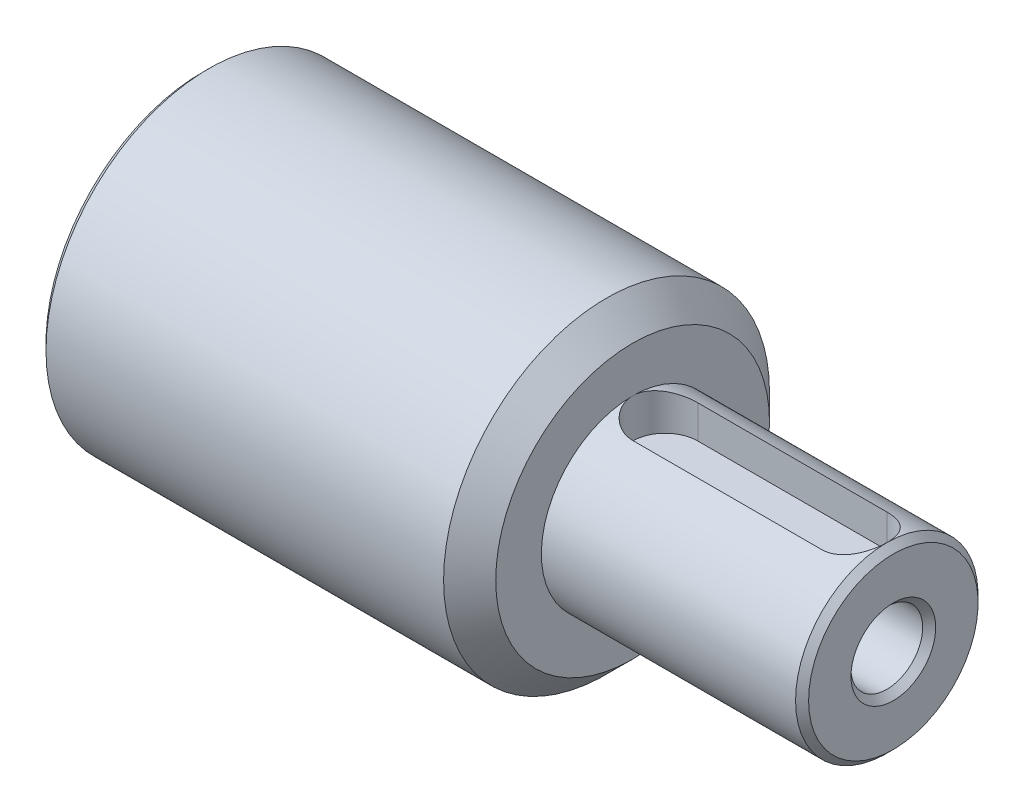
ISO-10303-21;
HEADER;
FILE_DESCRIPTION(('STEP AP214'),'2;1');
FILE_NAME('part.step','',(''),(''),'','','');
FILE_SCHEMA(('AUTOMOTIVE_DESIGN { 1 0 10303 214 1 1 1 1 }'));
ENDSEC;
DATA;
#1=APPLICATION_CONTEXT('core data for automotive mechanical design processes');
#2=APPLICATION_PROTOCOL_DEFINITION('international standard','automotive_design',2000,#1);
#3=PRODUCT_CONTEXT('',#1,'mechanical');
#4=PRODUCT('Part','Part','',(#3));
#5=PRODUCT_RELATED_PRODUCT_CATEGORY('part','',(#4));
#6=PRODUCT_DEFINITION_FORMATION('','',#4);
#7=PRODUCT_DEFINITION_CONTEXT('part definition',#1,'design');
#8=PRODUCT_DEFINITION('design','',#6,#7);
#9=PRODUCT_DEFINITION_SHAPE('','',#8);
#10=(LENGTH_UNIT() NAMED_UNIT(*) SI_UNIT(.MILLI.,.METRE.));
#11=(NAMED_UNIT(*) PLANE_ANGLE_UNIT() SI_UNIT($,.RADIAN.));
#12=(NAMED_UNIT(*) SI_UNIT($,.STERADIAN.) SOLID_ANGLE_UNIT());
#13=UNCERTAINTY_MEASURE_WITH_UNIT(LENGTH_MEASURE(1.E-05),#10,'distance_accuracy_value','');
#14=(GEOMETRIC_REPRESENTATION_CONTEXT(3) GLOBAL_UNCERTAINTY_ASSIGNED_CONTEXT((#13)) GLOBAL_UNIT_ASSIGNED_CONTEXT((#10,
#11,#12)) REPRESENTATION_CONTEXT('',''));
#15=CARTESIAN_POINT('',(0.,0.,0.));
#16=DIRECTION('',(0.,0.,1.));
#17=DIRECTION('',(1.,0.,0.));
#18=AXIS2_PLACEMENT_3D('',#15,#16,#17);
#19=CARTESIAN_POINT('',(0.,0.,0.));
#20=DIRECTION('',(-1.,0.,0.));
#21=DIRECTION('',(0.,0.,1.));
#22=AXIS2_PLACEMENT_3D('',#19,#20,#21);
#23=CYLINDRICAL_SURFACE('',#22,7.);
#24=CARTESIAN_POINT('',(27.,0.,0.));
#25=DIRECTION('',(1.,0.,0.));
#26=DIRECTION('',(0.,0.,-1.));
#27=AXIS2_PLACEMENT_3D('',#24,#25,#26);
#28=CIRCLE('',#27,7.);
#29=CARTESIAN_POINT('',(27.,0.,-7.));
#30=VERTEX_POINT('',#29);
#31=EDGE_CURVE('E186',#30,#30,#28,.T.);
#32=ORIENTED_EDGE('',*,*,#31,.T.);
#33=EDGE_LOOP('',(#32));
#34=FACE_BOUND('',#33,.T.);
#35=DIRECTION('',(-1.,0.,0.));
#36=VECTOR('',#35,1.);
#37=CARTESIAN_POINT('',(0.,6.53834841531101,-2.5));
#38=LINE('',#37,#36);
#39=CARTESIAN_POINT('',(26.,6.53834841531101,-2.5));
#40=VERTEX_POINT('',#39);
#41=CARTESIAN_POINT('',(0.499999999999983,6.53834841531101,-2.5));
#42=VERTEX_POINT('',#41);
#43=EDGE_CURVE('E486',#40,#42,#38,.T.);
#44=ORIENTED_EDGE('',*,*,#43,.T.);
#45=CARTESIAN_POINT('',(0.499999999999983,0.,0.));
#46=DIRECTION('',(1.,0.,0.));
#47=DIRECTION('',(0.,0.,-1.));
#48=AXIS2_PLACEMENT_3D('',#45,#46,#47);
#49=CIRCLE('',#48,7.);
#50=CARTESIAN_POINT('',(0.499999999999983,6.53834841531101,2.5));
#51=VERTEX_POINT('',#50);
#52=EDGE_CURVE('E234',#42,#51,#49,.F.);
#53=ORIENTED_EDGE('',*,*,#52,.T.);
#54=DIRECTION('',(-1.,0.,0.));
#55=VECTOR('',#54,1.);
#56=CARTESIAN_POINT('',(0.,6.53834841531101,2.5));
#57=LINE('',#56,#55);
#58=CARTESIAN_POINT('',(26.,6.53834841531101,2.5));
#59=VERTEX_POINT('',#58);
#60=EDGE_CURVE('E205',#51,#59,#57,.F.);
#61=ORIENTED_EDGE('',*,*,#60,.T.);
#62=CARTESIAN_POINT('',(26.,0.,0.));
#63=DIRECTION('',(-1.,0.,0.));
#64=DIRECTION('',(0.,0.,1.));
#65=AXIS2_PLACEMENT_3D('',#62,#63,#64);
#66=CIRCLE('',#65,7.);
#67=EDGE_CURVE('E202',#40,#59,#66,.F.);
#68=ORIENTED_EDGE('',*,*,#67,.F.);
#69=EDGE_LOOP('',(#44,#53,#61,#68));
#70=FACE_BOUND('',#69,.T.);
#71=ADVANCED_FACE('F39',(#34,#70),#23,.F.);
#72=CARTESIAN_POINT('',(0.,7.,0.));
#73=DIRECTION('',(1.,0.,0.));
#74=DIRECTION('',(0.,0.,-1.));
#75=AXIS2_PLACEMENT_3D('',#72,#73,#74);
#76=PLANE('',#75);
#77=CARTESIAN_POINT('',(0.,0.,0.));
#78=DIRECTION('',(1.,0.,0.));
#79=DIRECTION('',(0.,0.,-1.));
#80=AXIS2_PLACEMENT_3D('',#77,#78,#79);
#81=CIRCLE('',#80,12.);
#82=CARTESIAN_POINT('',(0.,0.,-12.));
#83=VERTEX_POINT('',#82);
#84=EDGE_CURVE('E219',#83,#83,#81,.F.);
#85=ORIENTED_EDGE('',*,*,#84,.T.);
#86=EDGE_LOOP('',(#85));
#87=FACE_BOUND('',#86,.T.);
#88=DIRECTION('',(0.,-1.,0.));
#89=VECTOR('',#88,1.);
#90=CARTESIAN_POINT('',(0.,7.,2.5));
#91=LINE('',#90,#89);
#92=CARTESIAN_POINT('',(0.,9.,2.5));
#93=VERTEX_POINT('',#92);
#94=CARTESIAN_POINT('',(0.,7.07106781186546,2.5));
#95=VERTEX_POINT('',#94);
#96=EDGE_CURVE('E198',#93,#95,#91,.T.);
#97=ORIENTED_EDGE('',*,*,#96,.T.);
#98=CARTESIAN_POINT('',(0.,0.,0.));
#99=DIRECTION('',(1.,0.,0.));
#100=DIRECTION('',(0.,0.,-1.));
#101=AXIS2_PLACEMENT_3D('',#98,#99,#100);
#102=CIRCLE('',#101,7.49999999999999);
#103=CARTESIAN_POINT('',(0.,7.07106781186546,-2.5));
#104=VERTEX_POINT('',#103);
#105=EDGE_CURVE('E217',#95,#104,#102,.T.);
#106=ORIENTED_EDGE('',*,*,#105,.T.);
#107=DIRECTION('',(0.,-1.,0.));
#108=VECTOR('',#107,1.);
#109=CARTESIAN_POINT('',(0.,9.,-2.5));
#110=LINE('',#109,#108);
#111=CARTESIAN_POINT('',(0.,9.,-2.5));
#112=VERTEX_POINT('',#111);
#113=EDGE_CURVE('E495',#112,#104,#110,.T.);
#114=ORIENTED_EDGE('',*,*,#113,.F.);
#115=DIRECTION('',(0.,0.,-1.));
#116=VECTOR('',#115,1.);
#117=CARTESIAN_POINT('',(0.,9.,-2.5));
#118=LINE('',#117,#116);
#119=EDGE_CURVE('E479',#93,#112,#118,.T.);
#120=ORIENTED_EDGE('',*,*,#119,.F.);
#121=EDGE_LOOP('',(#97,#106,#114,#120));
#122=FACE_BOUND('',#121,.T.);
#123=ADVANCED_FACE('F277',(#87,#122),#76,.F.);
#124=CARTESIAN_POINT('',(0.,0.,0.));
#125=DIRECTION('',(-1.,0.,0.));
#126=DIRECTION('',(0.,0.,1.));
#127=AXIS2_PLACEMENT_3D('',#124,#125,#126);
#128=CYLINDRICAL_SURFACE('',#127,12.5);
#129=CARTESIAN_POINT('',(0.499999999999978,0.,0.));
#130=DIRECTION('',(1.,0.,0.));
#131=DIRECTION('',(0.,0.,-1.));
#132=AXIS2_PLACEMENT_3D('',#129,#130,#131);
#133=CIRCLE('',#132,12.5);
#134=CARTESIAN_POINT('',(0.499999999999978,0.,-12.5));
#135=VERTEX_POINT('',#134);
#136=EDGE_CURVE('E222',#135,#135,#133,.T.);
#137=ORIENTED_EDGE('',*,*,#136,.T.);
#138=EDGE_LOOP('',(#137));
#139=FACE_BOUND('',#138,.T.);
#140=CARTESIAN_POINT('',(31.,0.,0.));
#141=DIRECTION('',(-1.,0.,0.));
#142=DIRECTION('',(0.,0.,1.));
#143=AXIS2_PLACEMENT_3D('',#140,#141,#142);
#144=CIRCLE('',#143,12.5);
#145=CARTESIAN_POINT('',(31.,0.,12.5));
#146=VERTEX_POINT('',#145);
#147=EDGE_CURVE('E211',#146,#146,#144,.T.);
#148=ORIENTED_EDGE('',*,*,#147,.T.);
#149=EDGE_LOOP('',(#148));
#150=FACE_BOUND('',#149,.T.);
#151=ADVANCED_FACE('F283',(#139,#150),#128,.T.);
#152=CARTESIAN_POINT('',(33.,12.5,0.));
#153=DIRECTION('',(-1.,0.,0.));
#154=DIRECTION('',(0.,0.,1.));
#155=AXIS2_PLACEMENT_3D('',#152,#153,#154);
#156=PLANE('',#155);
#157=CARTESIAN_POINT('',(33.,0.,0.));
#158=DIRECTION('',(-1.,0.,0.));
#159=DIRECTION('',(0.,0.,1.));
#160=AXIS2_PLACEMENT_3D('',#157,#158,#159);
#161=CIRCLE('',#160,10.5);
#162=CARTESIAN_POINT('',(33.,0.,10.5));
#163=VERTEX_POINT('',#162);
#164=EDGE_CURVE('E214',#163,#163,#161,.F.);
#165=ORIENTED_EDGE('',*,*,#164,.T.);
#166=EDGE_LOOP('',(#165));
#167=FACE_BOUND('',#166,.T.);
#168=CARTESIAN_POINT('',(33.,0.,0.));
#169=DIRECTION('',(-1.,0.,0.));
#170=DIRECTION('',(0.,0.,1.));
#171=AXIS2_PLACEMENT_3D('',#168,#169,#170);
#172=CIRCLE('',#171,7.);
#173=CARTESIAN_POINT('',(33.,7.,0.));
#174=VERTEX_POINT('',#173);
#175=EDGE_CURVE('E195',#174,#174,#172,.T.);
#176=ORIENTED_EDGE('',*,*,#175,.T.);
#177=EDGE_LOOP('',(#176));
#178=FACE_BOUND('',#177,.T.);
#179=ADVANCED_FACE('F197',(#167,#178),#156,.F.);
#180=CARTESIAN_POINT('',(0.,0.,0.));
#181=DIRECTION('',(-1.,0.,0.));
#182=DIRECTION('',(0.,0.,1.));
#183=AXIS2_PLACEMENT_3D('',#180,#181,#182);
#184=CYLINDRICAL_SURFACE('',#183,7.);
#185=DIRECTION('',(-1.,0.,0.));
#186=VECTOR('',#185,1.);
#187=CARTESIAN_POINT('',(0.,6.53834841531101,-2.5));
#188=LINE('',#187,#186);
#189=CARTESIAN_POINT('',(35.5,6.53834841531101,-2.5));
#190=VERTEX_POINT('',#189);
#191=CARTESIAN_POINT('',(50.,6.53834841531101,-2.5));
#192=VERTEX_POINT('',#191);
#193=EDGE_CURVE('E43',#190,#192,#188,.F.);
#194=ORIENTED_EDGE('',*,*,#193,.T.);
#195=CARTESIAN_POINT('',(50.,6.53834841531101,-2.5));
#196=CARTESIAN_POINT('',(50.0678892457289,6.53833653785133,-2.50000932220903));
#197=CARTESIAN_POINT('',(50.1357719326391,6.53940549922738,-2.49723485076693));
#198=CARTESIAN_POINT('',(50.2710039106114,6.54361657478134,-2.48619102118159));
#199=CARTESIAN_POINT('',(50.3383533586061,6.54675805418063,-2.47792334551208));
#200=CARTESIAN_POINT('',(50.4718214146028,6.55501217637942,-2.45600175285899));
#201=CARTESIAN_POINT('',(50.5379433363398,6.56011831705676,-2.44236559963954));
#202=CARTESIAN_POINT('',(50.6687018351085,6.57213177854175,-2.40985115466648));
#203=CARTESIAN_POINT('',(50.7333383463124,6.57903917900746,-2.39097263107435));
#204=CARTESIAN_POINT('',(50.9242643664775,6.6021493436571,-2.32673964179204));
#205=CARTESIAN_POINT('',(51.0477904521356,6.62075475340845,-2.27375112606986));
#206=CARTESIAN_POINT('',(51.284230333128,6.6622539736071,-2.14910757865425));
#207=CARTESIAN_POINT('',(51.3971363167355,6.68515090424876,-2.07743895048849));
#208=CARTESIAN_POINT('',(51.6142152133527,6.73379913792224,-1.91402571101969));
#209=CARTESIAN_POINT('',(51.7178464751959,6.75962864041371,-1.82158337146743));
#210=CARTESIAN_POINT('',(51.9085087047164,6.81057592323031,-1.6207338877633));
#211=CARTESIAN_POINT('',(51.9955365792434,6.83569357019868,-1.51232377552673));
#212=CARTESIAN_POINT('',(52.153089855455,6.88331133279046,-1.27853915335934));
#213=CARTESIAN_POINT('',(52.2230315218605,6.90570835223797,-1.15274833789185));
#214=CARTESIAN_POINT('',(52.3405366467974,6.94442357672633,-0.890250825476634));
#215=CARTESIAN_POINT('',(52.388107779046,6.96074386585465,-0.753547890540325));
#216=CARTESIAN_POINT('',(52.4576406021824,6.9849105051071,-0.478829979256173));
#217=CARTESIAN_POINT('',(52.4805391304711,6.99306594352515,-0.341079835227465));
#218=CARTESIAN_POINT('',(52.5030684027776,7.00108798053822,-0.0634643052969029));
#219=CARTESIAN_POINT('',(52.5027055860347,7.00095687302702,0.0764004845074485));
#220=CARTESIAN_POINT('',(52.4792887262389,6.99262258049077,0.347593258486946));
#221=CARTESIAN_POINT('',(52.4572552058015,6.98478243583516,0.479022407078722));
#222=CARTESIAN_POINT('',(52.3928265758412,6.96237832507347,0.736175812143609));
#223=CARTESIAN_POINT('',(52.3504303156375,6.94781397899037,0.861899745780465));
#224=CARTESIAN_POINT('',(52.2459530884347,6.91316506890369,1.10616102429807));
#225=CARTESIAN_POINT('',(52.1836042850399,6.89300592164314,1.22457279066906));
#226=CARTESIAN_POINT('',(52.0412206647766,6.84923355616321,1.44953531305523));
#227=CARTESIAN_POINT('',(51.9611804762164,6.82561928959263,1.5560824517677));
#228=CARTESIAN_POINT('',(51.7806767363433,6.7759054780549,1.7603244525607));
#229=CARTESIAN_POINT('',(51.6793502768551,6.74974055843875,1.85724185700418));
#230=CARTESIAN_POINT('',(51.4616726358344,6.69890342468975,2.03299914621296));
#231=CARTESIAN_POINT('',(51.3453160948315,6.67423174765257,2.11183255456462));
#232=CARTESIAN_POINT('',(51.098057401478,6.62877803875405,2.25049860898458));
#233=CARTESIAN_POINT('',(50.9669210244946,6.60807875118994,2.30994207989625));
#234=CARTESIAN_POINT('',(50.6956351984178,6.57388213610267,2.40555439725849));
#235=CARTESIAN_POINT('',(50.555500858831,6.56037307165053,2.44176119399954));
#236=CARTESIAN_POINT('',(50.3449694557358,6.54708542245562,2.47705497148627));
#237=CARTESIAN_POINT('',(50.2762636982282,6.54382010967907,2.48565347586445));
#238=CARTESIAN_POINT('',(50.1383848358083,6.53944910829676,2.49712352174882));
#239=CARTESIAN_POINT('',(50.0692123328995,6.53834103140935,2.50000139665367));
#240=CARTESIAN_POINT('',(50.,6.53834841531101,2.5));
#241=B_SPLINE_CURVE_WITH_KNOTS('',3,(#195,#196,#197,#198,#199,#200,#201,#202,#203,#204,#205,
#206,#207,#208,#209,#210,#211,#212,#213,#214,#215,#216,#217,#218,#219,#220,#221,#222,#223,#224,
#225,#226,#227,#228,#229,#230,#231,#232,#233,#234,#235,#236,#237,#238,#239,#240),.UNSPECIFIED.,
.F.,.F.,(4,2,2,2,2,2,2,2,2,2,2,2,2,2,2,2,2,2,2,2,2,2,4),(0.,0.203591628551592,0.407120929225535,
0.609982356545741,0.812852756635989,1.21793118555512,1.6233052814847,2.0451597231193,
2.4670926781184,2.9018839896556,3.33652604665237,3.75400993940861,4.17137826416922,
4.56998920861347,4.96862268086887,5.37284909448639,5.77719841367921,6.20315837945088,
6.6292706567472,7.06347329058504,7.49696496492443,7.70468580162772,7.91217653896403),.UNSPECIFIED.);
#242=CARTESIAN_POINT('',(52.5,7.,0.));
#243=VERTEX_POINT('',#242);
#244=EDGE_CURVE('E157',#192,#243,#241,.T.);
#245=ORIENTED_EDGE('',*,*,#244,.T.);
#246=CARTESIAN_POINT('',(52.5,0.,0.));
#247=DIRECTION('',(-1.,0.,0.));
#248=DIRECTION('',(0.,0.,1.));
#249=AXIS2_PLACEMENT_3D('',#246,#247,#248);
#250=CIRCLE('',#249,7.);
#251=EDGE_CURVE('E326',#243,#243,#250,.T.);
#252=ORIENTED_EDGE('',*,*,#251,.T.);
#253=CARTESIAN_POINT('',(50.,6.53834841531101,2.5));
#254=VERTEX_POINT('',#253);
#255=EDGE_CURVE('E144',#243,#254,#241,.T.);
#256=ORIENTED_EDGE('',*,*,#255,.T.);
#257=DIRECTION('',(-1.,0.,0.));
#258=VECTOR('',#257,1.);
#259=CARTESIAN_POINT('',(0.,6.53834841531101,2.5));
#260=LINE('',#259,#258);
#261=CARTESIAN_POINT('',(35.5,6.53834841531101,2.5));
#262=VERTEX_POINT('',#261);
#263=EDGE_CURVE('E185',#254,#262,#260,.T.);
#264=ORIENTED_EDGE('',*,*,#263,.T.);
#265=CARTESIAN_POINT('',(35.5,6.53834841531101,2.5));
#266=CARTESIAN_POINT('',(35.4321107542711,6.53833653785133,2.50000932220903));
#267=CARTESIAN_POINT('',(35.3642280673609,6.53940549922738,2.49723485076693));
#268=CARTESIAN_POINT('',(35.2289960893886,6.54361657478134,2.48619102118159));
#269=CARTESIAN_POINT('',(35.1616466413939,6.54675805418062,2.47792334551208));
#270=CARTESIAN_POINT('',(35.0281785853972,6.55501217637942,2.45600175285899));
#271=CARTESIAN_POINT('',(34.9620566636602,6.56011831705676,2.44236559963955));
#272=CARTESIAN_POINT('',(34.8312981648915,6.57213177854175,2.40985115466648));
#273=CARTESIAN_POINT('',(34.7666616536876,6.57903917900746,2.39097263107435));
#274=CARTESIAN_POINT('',(34.5757356335225,6.6021493436571,2.32673964179204));
#275=CARTESIAN_POINT('',(34.4522095478644,6.62075475340845,2.27375112606986));
#276=CARTESIAN_POINT('',(34.215769666872,6.6622539736071,2.14910757865424));
#277=CARTESIAN_POINT('',(34.1028636832645,6.68515090424876,2.07743895048849));
#278=CARTESIAN_POINT('',(33.8857847866473,6.73379913792224,1.91402571101969));
#279=CARTESIAN_POINT('',(33.7821535248041,6.75962864041371,1.82158337146744));
#280=CARTESIAN_POINT('',(33.5914912952836,6.81057592323031,1.6207338877633));
#281=CARTESIAN_POINT('',(33.5044634207566,6.83569357019868,1.51232377552673));
#282=CARTESIAN_POINT('',(33.346910144545,6.88331133279046,1.27853915335934));
#283=CARTESIAN_POINT('',(33.2769684781395,6.90570835223797,1.15274833789185));
#284=CARTESIAN_POINT('',(33.1594633532026,6.94442357672633,0.89025082547663));
#285=CARTESIAN_POINT('',(33.111892220954,6.96074386585465,0.753547890540323));
#286=CARTESIAN_POINT('',(33.0423593978176,6.9849105051071,0.478829979256173));
#287=CARTESIAN_POINT('',(33.0194608695289,6.99306594352515,0.341079835227464));
#288=CARTESIAN_POINT('',(32.9969315972224,7.00108798053822,0.0634643052969026));
#289=CARTESIAN_POINT('',(32.9972944139653,7.00095687302702,-0.0764004845074487));
#290=CARTESIAN_POINT('',(33.0207112737611,6.99262258049077,-0.347593258486946));
#291=CARTESIAN_POINT('',(33.0427447941985,6.98478243583516,-0.479022407078721));
#292=CARTESIAN_POINT('',(33.1071734241588,6.96237832507347,-0.736175812143608));
#293=CARTESIAN_POINT('',(33.1495696843625,6.94781397899037,-0.861899745780464));
#294=CARTESIAN_POINT('',(33.2540469115653,6.91316506890369,-1.10616102429807));
#295=CARTESIAN_POINT('',(33.3163957149601,6.89300592164314,-1.22457279066906));
#296=CARTESIAN_POINT('',(33.4587793352234,6.8492335561632,-1.44953531305523));
#297=CARTESIAN_POINT('',(33.5388195237836,6.82561928959263,-1.5560824517677));
#298=CARTESIAN_POINT('',(33.7193232636567,6.7759054780549,-1.7603244525607));
#299=CARTESIAN_POINT('',(33.8206497231449,6.74974055843875,-1.85724185700417));
#300=CARTESIAN_POINT('',(34.0383273641656,6.69890342468975,-2.03299914621296));
#301=CARTESIAN_POINT('',(34.1546839051685,6.67423174765257,-2.11183255456462));
#302=CARTESIAN_POINT('',(34.401942598522,6.62877803875405,-2.25049860898458));
#303=CARTESIAN_POINT('',(34.5330789755054,6.60807875118994,-2.30994207989625));
#304=CARTESIAN_POINT('',(34.8043648015822,6.57388213610267,-2.40555439725849));
#305=CARTESIAN_POINT('',(34.944499141169,6.56037307165054,-2.44176119399954));
#306=CARTESIAN_POINT('',(35.1550305442642,6.54708542245562,-2.47705497148627));
#307=CARTESIAN_POINT('',(35.2237363017718,6.54382010967907,-2.48565347586445));
#308=CARTESIAN_POINT('',(35.3616151641917,6.53944910829676,-2.49712352174882));
#309=CARTESIAN_POINT('',(35.4307876671005,6.53834103140935,-2.50000139665367));
#310=CARTESIAN_POINT('',(35.5,6.53834841531101,-2.5));
#311=B_SPLINE_CURVE_WITH_KNOTS('',3,(#265,#266,#267,#268,#269,#270,#271,#272,#273,#274,#275,
#276,#277,#278,#279,#280,#281,#282,#283,#284,#285,#286,#287,#288,#289,#290,#291,#292,#293,#294,
#295,#296,#297,#298,#299,#300,#301,#302,#303,#304,#305,#306,#307,#308,#309,#310),.UNSPECIFIED.,
.F.,.F.,(4,2,2,2,2,2,2,2,2,2,2,2,2,2,2,2,2,2,2,2,2,2,4),(0.,0.203591628551585,0.407120929225528,
0.609982356545734,0.812852756635989,1.21793118555513,1.6233052814847,2.0451597231193,
2.4670926781184,2.90188398965561,3.33652604665238,3.75400993940861,4.17137826416922,
4.56998920861347,4.96862268086887,5.37284909448639,5.77719841367921,6.20315837945087,
6.6292706567472,7.06347329058503,7.49696496492444,7.70468580162773,7.91217653896403),.UNSPECIFIED.);
#312=EDGE_CURVE('E11',#262,#174,#311,.T.);
#313=ORIENTED_EDGE('',*,*,#312,.T.);
#314=ORIENTED_EDGE('',*,*,#175,.F.);
#315=EDGE_CURVE('E49',#174,#190,#311,.T.);
#316=ORIENTED_EDGE('',*,*,#315,.T.);
#317=EDGE_LOOP('',(#194,#245,#252,#256,#264,#313,#314,#316));
#318=FACE_BOUND('',#317,.T.);
#319=ADVANCED_FACE('F160',(#318),#184,.T.);
#320=CARTESIAN_POINT('',(53.,7.,0.));
#321=DIRECTION('',(-1.,0.,0.));
#322=DIRECTION('',(0.,0.,1.));
#323=AXIS2_PLACEMENT_3D('',#320,#321,#322);
#324=PLANE('',#323);
#325=CARTESIAN_POINT('',(53.,0.,0.));
#326=DIRECTION('',(-1.,0.,0.));
#327=DIRECTION('',(0.,0.,1.));
#328=AXIS2_PLACEMENT_3D('',#325,#326,#327);
#329=CIRCLE('',#328,3.25);
#330=CARTESIAN_POINT('',(53.,0.,3.25));
#331=VERTEX_POINT('',#330);
#332=EDGE_CURVE('E228',#331,#331,#329,.T.);
#333=ORIENTED_EDGE('',*,*,#332,.T.);
#334=EDGE_LOOP('',(#333));
#335=FACE_BOUND('',#334,.T.);
#336=CARTESIAN_POINT('',(53.,0.,0.));
#337=DIRECTION('',(-1.,0.,0.));
#338=DIRECTION('',(0.,0.,1.));
#339=AXIS2_PLACEMENT_3D('',#336,#337,#338);
#340=CIRCLE('',#339,6.49999999999999);
#341=CARTESIAN_POINT('',(53.,0.,6.49999999999999));
#342=VERTEX_POINT('',#341);
#343=EDGE_CURVE('E225',#342,#342,#340,.F.);
#344=ORIENTED_EDGE('',*,*,#343,.T.);
#345=EDGE_LOOP('',(#344));
#346=FACE_BOUND('',#345,.T.);
#347=ADVANCED_FACE('F268',(#335,#346),#324,.F.);
#348=CARTESIAN_POINT('',(0.,0.,0.));
#349=DIRECTION('',(-1.,0.,0.));
#350=DIRECTION('',(0.,0.,1.));
#351=AXIS2_PLACEMENT_3D('',#348,#349,#350);
#352=CYLINDRICAL_SURFACE('',#351,2.75);
#353=CARTESIAN_POINT('',(52.5,0.,0.));
#354=DIRECTION('',(-1.,0.,0.));
#355=DIRECTION('',(0.,0.,1.));
#356=AXIS2_PLACEMENT_3D('',#353,#354,#355);
#357=CIRCLE('',#356,2.75);
#358=CARTESIAN_POINT('',(52.5,0.,2.75));
#359=VERTEX_POINT('',#358);
#360=EDGE_CURVE('E231',#359,#359,#357,.F.);
#361=ORIENTED_EDGE('',*,*,#360,.T.);
#362=EDGE_LOOP('',(#361));
#363=FACE_BOUND('',#362,.T.);
#364=CARTESIAN_POINT('',(28.,0.,0.));
#365=DIRECTION('',(-1.,0.,0.));
#366=DIRECTION('',(0.,0.,1.));
#367=AXIS2_PLACEMENT_3D('',#364,#365,#366);
#368=CIRCLE('',#367,2.75);
#369=CARTESIAN_POINT('',(28.,0.,2.75));
#370=VERTEX_POINT('',#369);
#371=EDGE_CURVE('E199',#370,#370,#368,.T.);
#372=ORIENTED_EDGE('',*,*,#371,.T.);
#373=EDGE_LOOP('',(#372));
#374=FACE_BOUND('',#373,.T.);
#375=ADVANCED_FACE('F265',(#363,#374),#352,.F.);
#376=CARTESIAN_POINT('',(28.,2.75,0.));
#377=DIRECTION('',(1.,0.,0.));
#378=DIRECTION('',(0.,0.,-1.));
#379=AXIS2_PLACEMENT_3D('',#376,#377,#378);
#380=PLANE('',#379);
#381=CARTESIAN_POINT('',(28.,0.,0.));
#382=DIRECTION('',(1.,0.,0.));
#383=DIRECTION('',(0.,0.,-1.));
#384=AXIS2_PLACEMENT_3D('',#381,#382,#383);
#385=CIRCLE('',#384,6.);
#386=CARTESIAN_POINT('',(28.,0.,-6.));
#387=VERTEX_POINT('',#386);
#388=EDGE_CURVE('E327',#387,#387,#385,.F.);
#389=ORIENTED_EDGE('',*,*,#388,.T.);
#390=EDGE_LOOP('',(#389));
#391=FACE_BOUND('',#390,.T.);
#392=ORIENTED_EDGE('',*,*,#371,.F.);
#393=EDGE_LOOP('',(#392));
#394=FACE_BOUND('',#393,.T.);
#395=ADVANCED_FACE('F262',(#391,#394),#380,.F.);
#396=CARTESIAN_POINT('',(26.,0.,0.));
#397=DIRECTION('',(-1.,0.,0.));
#398=DIRECTION('',(0.,0.,1.));
#399=AXIS2_PLACEMENT_3D('',#396,#397,#398);
#400=PLANE('',#399);
#401=ORIENTED_EDGE('',*,*,#67,.T.);
#402=DIRECTION('',(0.,1.,0.));
#403=VECTOR('',#402,1.);
#404=CARTESIAN_POINT('',(26.,9.,2.5));
#405=LINE('',#404,#403);
#406=CARTESIAN_POINT('',(26.,9.,2.5));
#407=VERTEX_POINT('',#406);
#408=EDGE_CURVE('E158',#59,#407,#405,.T.);
#409=ORIENTED_EDGE('',*,*,#408,.T.);
#410=DIRECTION('',(0.,0.,-1.));
#411=VECTOR('',#410,1.);
#412=CARTESIAN_POINT('',(26.,9.,-2.5));
#413=LINE('',#412,#411);
#414=CARTESIAN_POINT('',(26.,9.,-2.5));
#415=VERTEX_POINT('',#414);
#416=EDGE_CURVE('E498',#407,#415,#413,.T.);
#417=ORIENTED_EDGE('',*,*,#416,.T.);
#418=DIRECTION('',(0.,-1.,0.));
#419=VECTOR('',#418,1.);
#420=CARTESIAN_POINT('',(26.,9.,-2.5));
#421=LINE('',#420,#419);
#422=EDGE_CURVE('E493',#415,#40,#421,.T.);
#423=ORIENTED_EDGE('',*,*,#422,.T.);
#424=EDGE_LOOP('',(#401,#409,#417,#423));
#425=FACE_BOUND('',#424,.T.);
#426=ADVANCED_FACE('F177',(#425),#400,.T.);
#427=CARTESIAN_POINT('',(26.,9.,2.5));
#428=DIRECTION('',(0.,0.,1.));
#429=DIRECTION('',(0.,-1.,0.));
#430=AXIS2_PLACEMENT_3D('',#427,#428,#429);
#431=PLANE('',#430);
#432=ORIENTED_EDGE('',*,*,#60,.F.);
#433=CARTESIAN_POINT('',(0.499999999999983,6.53834841531101,2.5));
#434=CARTESIAN_POINT('',(0.416873151396492,6.62732879171729,2.5));
#435=CARTESIAN_POINT('',(0.333643058480312,6.71621226503221,2.5));
#436=CARTESIAN_POINT('',(0.166976391794394,6.89378539719895,2.5));
#437=CARTESIAN_POINT('',(0.0835398180439126,6.98247505606885,2.5));
#438=CARTESIAN_POINT('',(0.,7.07106781186546,2.5));
#439=B_SPLINE_CURVE_WITH_KNOTS('',3,(#433,#434,#435,#436,#437,#438),.UNSPECIFIED.,.F.,.F.,(4,2,
4),(0.,0.365304916143004,0.730609798217001),.UNSPECIFIED.);
#440=EDGE_CURVE('E237',#51,#95,#439,.T.);
#441=ORIENTED_EDGE('',*,*,#440,.T.);
#442=ORIENTED_EDGE('',*,*,#96,.F.);
#443=DIRECTION('',(-1.,0.,0.));
#444=VECTOR('',#443,1.);
#445=CARTESIAN_POINT('',(26.,9.,2.5));
#446=LINE('',#445,#444);
#447=EDGE_CURVE('E483',#407,#93,#446,.T.);
#448=ORIENTED_EDGE('',*,*,#447,.F.);
#449=ORIENTED_EDGE('',*,*,#408,.F.);
#450=EDGE_LOOP('',(#432,#441,#442,#448,#449));
#451=FACE_BOUND('',#450,.T.);
#452=ADVANCED_FACE('F254',(#451),#431,.F.);
#453=CARTESIAN_POINT('',(26.,9.,-2.5));
#454=DIRECTION('',(0.,0.,-1.));
#455=DIRECTION('',(0.,1.,0.));
#456=AXIS2_PLACEMENT_3D('',#453,#454,#455);
#457=PLANE('',#456);
#458=ORIENTED_EDGE('',*,*,#113,.T.);
#459=CARTESIAN_POINT('',(0.,7.07106781186546,-2.5));
#460=CARTESIAN_POINT('',(0.0835398180439125,6.98247505606885,-2.5));
#461=CARTESIAN_POINT('',(0.166976391794393,6.89378539719895,-2.5));
#462=CARTESIAN_POINT('',(0.333643058480312,6.71621226503221,-2.5));
#463=CARTESIAN_POINT('',(0.416873151396492,6.62732879171729,-2.5));
#464=CARTESIAN_POINT('',(0.499999999999983,6.53834841531101,-2.5));
#465=B_SPLINE_CURVE_WITH_KNOTS('',3,(#459,#460,#461,#462,#463,#464),.UNSPECIFIED.,.F.,.F.,(4,2,
4),(0.,0.365304882073997,0.730609798217001),.UNSPECIFIED.);
#466=EDGE_CURVE('E64',#104,#42,#465,.T.);
#467=ORIENTED_EDGE('',*,*,#466,.T.);
#468=ORIENTED_EDGE('',*,*,#43,.F.);
#469=ORIENTED_EDGE('',*,*,#422,.F.);
#470=DIRECTION('',(-1.,0.,0.));
#471=VECTOR('',#470,1.);
#472=CARTESIAN_POINT('',(26.,9.,-2.5));
#473=LINE('',#472,#471);
#474=EDGE_CURVE('E489',#415,#112,#473,.T.);
#475=ORIENTED_EDGE('',*,*,#474,.T.);
#476=EDGE_LOOP('',(#458,#467,#468,#469,#475));
#477=FACE_BOUND('',#476,.T.);
#478=ADVANCED_FACE('F259',(#477),#457,.F.);
#479=CARTESIAN_POINT('',(26.,9.,-2.5));
#480=DIRECTION('',(0.,1.,0.));
#481=DIRECTION('',(0.,0.,1.));
#482=AXIS2_PLACEMENT_3D('',#479,#480,#481);
#483=PLANE('',#482);
#484=ORIENTED_EDGE('',*,*,#119,.T.);
#485=ORIENTED_EDGE('',*,*,#474,.F.);
#486=ORIENTED_EDGE('',*,*,#416,.F.);
#487=ORIENTED_EDGE('',*,*,#447,.T.);
#488=EDGE_LOOP('',(#484,#485,#486,#487));
#489=FACE_BOUND('',#488,.T.);
#490=ADVANCED_FACE('F261',(#489),#483,.F.);
#491=CARTESIAN_POINT('',(31.,0.,0.));
#492=DIRECTION('',(-1.,0.,0.));
#493=DIRECTION('',(0.,0.,1.));
#494=AXIS2_PLACEMENT_3D('',#491,#492,#493);
#495=CONICAL_SURFACE('',#494,12.5,0.78539816339745);
#496=ORIENTED_EDGE('',*,*,#164,.F.);
#497=EDGE_LOOP('',(#496));
#498=FACE_BOUND('',#497,.T.);
#499=ORIENTED_EDGE('',*,*,#147,.F.);
#500=EDGE_LOOP('',(#499));
#501=FACE_BOUND('',#500,.T.);
#502=ADVANCED_FACE('F291',(#498,#501),#495,.T.);
#503=CARTESIAN_POINT('',(0.,0.,0.));
#504=DIRECTION('',(1.,0.,0.));
#505=DIRECTION('',(0.,0.,-1.));
#506=AXIS2_PLACEMENT_3D('',#503,#504,#505);
#507=CONICAL_SURFACE('',#506,12.,0.785398163397447);
#508=ORIENTED_EDGE('',*,*,#136,.F.);
#509=EDGE_LOOP('',(#508));
#510=FACE_BOUND('',#509,.T.);
#511=ORIENTED_EDGE('',*,*,#84,.F.);
#512=EDGE_LOOP('',(#511));
#513=FACE_BOUND('',#512,.T.);
#514=ADVANCED_FACE('F297',(#510,#513),#507,.T.);
#515=CARTESIAN_POINT('',(53.,0.,0.));
#516=DIRECTION('',(1.,0.,0.));
#517=DIRECTION('',(0.,0.,-1.));
#518=AXIS2_PLACEMENT_3D('',#515,#516,#517);
#519=CONICAL_SURFACE('',#518,3.25,0.785398163397444);
#520=ORIENTED_EDGE('',*,*,#360,.F.);
#521=EDGE_LOOP('',(#520));
#522=FACE_BOUND('',#521,.T.);
#523=ORIENTED_EDGE('',*,*,#332,.F.);
#524=EDGE_LOOP('',(#523));
#525=FACE_BOUND('',#524,.T.);
#526=ADVANCED_FACE('F303',(#522,#525),#519,.F.);
#527=CARTESIAN_POINT('',(0.499999999999983,0.,0.));
#528=DIRECTION('',(-1.,0.,0.));
#529=DIRECTION('',(0.,0.,1.));
#530=AXIS2_PLACEMENT_3D('',#527,#528,#529);
#531=CONICAL_SURFACE('',#530,7.,0.785398163397453);
#532=ORIENTED_EDGE('',*,*,#466,.F.);
#533=ORIENTED_EDGE('',*,*,#105,.F.);
#534=ORIENTED_EDGE('',*,*,#440,.F.);
#535=ORIENTED_EDGE('',*,*,#52,.F.);
#536=EDGE_LOOP('',(#532,#533,#534,#535));
#537=FACE_BOUND('',#536,.T.);
#538=ADVANCED_FACE('F251',(#537),#531,.F.);
#539=CARTESIAN_POINT('',(52.5,0.,0.));
#540=DIRECTION('',(-1.,0.,0.));
#541=DIRECTION('',(0.,0.,1.));
#542=AXIS2_PLACEMENT_3D('',#539,#540,#541);
#543=CONICAL_SURFACE('',#542,7.,0.785398163397449);
#544=ORIENTED_EDGE('',*,*,#343,.F.);
#545=EDGE_LOOP('',(#544));
#546=FACE_BOUND('',#545,.T.);
#547=ORIENTED_EDGE('',*,*,#251,.F.);
#548=EDGE_LOOP('',(#547));
#549=FACE_BOUND('',#548,.T.);
#550=ADVANCED_FACE('F312',(#546,#549),#543,.T.);
#551=CARTESIAN_POINT('',(27.,0.,0.));
#552=DIRECTION('',(1.,0.,0.));
#553=DIRECTION('',(0.,0.,-1.));
#554=AXIS2_PLACEMENT_3D('',#551,#552,#553);
#555=TOROIDAL_SURFACE('',#554,6.,1.);
#556=ORIENTED_EDGE('',*,*,#31,.F.);
#557=EDGE_LOOP('',(#556));
#558=FACE_BOUND('',#557,.T.);
#559=ORIENTED_EDGE('',*,*,#388,.F.);
#560=EDGE_LOOP('',(#559));
#561=FACE_BOUND('',#560,.T.);
#562=ADVANCED_FACE('F41',(#558,#561),#555,.F.);
#563=CARTESIAN_POINT('',(35.5,4.,0.));
#564=DIRECTION('',(0.,1.,0.));
#565=DIRECTION('',(0.,0.,1.));
#566=AXIS2_PLACEMENT_3D('',#563,#564,#565);
#567=CYLINDRICAL_SURFACE('',#566,2.5);
#568=DIRECTION('',(0.,1.,0.));
#569=VECTOR('',#568,1.);
#570=CARTESIAN_POINT('',(35.5,4.,2.5));
#571=LINE('',#570,#569);
#572=CARTESIAN_POINT('',(35.5,4.,2.5));
#573=VERTEX_POINT('',#572);
#574=EDGE_CURVE('E56',#573,#262,#571,.T.);
#575=ORIENTED_EDGE('',*,*,#574,.F.);
#576=CARTESIAN_POINT('',(35.5,4.,0.));
#577=DIRECTION('',(0.,1.,0.));
#578=DIRECTION('',(0.,0.,1.));
#579=AXIS2_PLACEMENT_3D('',#576,#577,#578);
#580=CIRCLE('',#579,2.5);
#581=CARTESIAN_POINT('',(35.5,4.,-2.5));
#582=VERTEX_POINT('',#581);
#583=EDGE_CURVE('E121',#582,#573,#580,.T.);
#584=ORIENTED_EDGE('',*,*,#583,.F.);
#585=DIRECTION('',(0.,1.,0.));
#586=VECTOR('',#585,1.);
#587=CARTESIAN_POINT('',(35.5,4.,-2.5));
#588=LINE('',#587,#586);
#589=EDGE_CURVE('E142',#582,#190,#588,.T.);
#590=ORIENTED_EDGE('',*,*,#589,.T.);
#591=ORIENTED_EDGE('',*,*,#315,.F.);
#592=ORIENTED_EDGE('',*,*,#312,.F.);
#593=EDGE_LOOP('',(#575,#584,#590,#591,#592));
#594=FACE_BOUND('',#593,.T.);
#595=ADVANCED_FACE('F118',(#594),#567,.F.);
#596=CARTESIAN_POINT('',(35.5,4.,-2.5));
#597=DIRECTION('',(0.,0.,-1.));
#598=DIRECTION('',(-1.,0.,0.));
#599=AXIS2_PLACEMENT_3D('',#596,#597,#598);
#600=PLANE('',#599);
#601=ORIENTED_EDGE('',*,*,#589,.F.);
#602=DIRECTION('',(-1.,0.,0.));
#603=VECTOR('',#602,1.);
#604=CARTESIAN_POINT('',(35.5,4.,-2.5));
#605=LINE('',#604,#603);
#606=CARTESIAN_POINT('',(50.,4.,-2.5));
#607=VERTEX_POINT('',#606);
#608=EDGE_CURVE('E125',#607,#582,#605,.T.);
#609=ORIENTED_EDGE('',*,*,#608,.F.);
#610=DIRECTION('',(0.,1.,0.));
#611=VECTOR('',#610,1.);
#612=CARTESIAN_POINT('',(50.,4.,-2.5));
#613=LINE('',#612,#611);
#614=EDGE_CURVE('E145',#607,#192,#613,.T.);
#615=ORIENTED_EDGE('',*,*,#614,.T.);
#616=ORIENTED_EDGE('',*,*,#193,.F.);
#617=EDGE_LOOP('',(#601,#609,#615,#616));
#618=FACE_BOUND('',#617,.T.);
#619=ADVANCED_FACE('F170',(#618),#600,.F.);
#620=CARTESIAN_POINT('',(35.5,4.,2.5));
#621=DIRECTION('',(0.,0.,1.));
#622=DIRECTION('',(1.,0.,0.));
#623=AXIS2_PLACEMENT_3D('',#620,#621,#622);
#624=PLANE('',#623);
#625=DIRECTION('',(0.,1.,0.));
#626=VECTOR('',#625,1.);
#627=CARTESIAN_POINT('',(50.,4.,2.5));
#628=LINE('',#627,#626);
#629=CARTESIAN_POINT('',(50.,4.,2.5));
#630=VERTEX_POINT('',#629);
#631=EDGE_CURVE('E124',#630,#254,#628,.T.);
#632=ORIENTED_EDGE('',*,*,#631,.F.);
#633=DIRECTION('',(1.,0.,0.));
#634=VECTOR('',#633,1.);
#635=CARTESIAN_POINT('',(35.5,4.,2.5));
#636=LINE('',#635,#634);
#637=EDGE_CURVE('E128',#573,#630,#636,.T.);
#638=ORIENTED_EDGE('',*,*,#637,.F.);
#639=ORIENTED_EDGE('',*,*,#574,.T.);
#640=ORIENTED_EDGE('',*,*,#263,.F.);
#641=EDGE_LOOP('',(#632,#638,#639,#640));
#642=FACE_BOUND('',#641,.T.);
#643=ADVANCED_FACE('F129',(#642),#624,.F.);
#644=CARTESIAN_POINT('',(50.,4.,0.));
#645=DIRECTION('',(0.,1.,0.));
#646=DIRECTION('',(0.,0.,1.));
#647=AXIS2_PLACEMENT_3D('',#644,#645,#646);
#648=CYLINDRICAL_SURFACE('',#647,2.5);
#649=ORIENTED_EDGE('',*,*,#614,.F.);
#650=CARTESIAN_POINT('',(50.,4.,0.));
#651=DIRECTION('',(0.,1.,0.));
#652=DIRECTION('',(0.,0.,1.));
#653=AXIS2_PLACEMENT_3D('',#650,#651,#652);
#654=CIRCLE('',#653,2.5);
#655=EDGE_CURVE('E134',#630,#607,#654,.T.);
#656=ORIENTED_EDGE('',*,*,#655,.F.);
#657=ORIENTED_EDGE('',*,*,#631,.T.);
#658=ORIENTED_EDGE('',*,*,#255,.F.);
#659=ORIENTED_EDGE('',*,*,#244,.F.);
#660=EDGE_LOOP('',(#649,#656,#657,#658,#659));
#661=FACE_BOUND('',#660,.T.);
#662=ADVANCED_FACE('F164',(#661),#648,.F.);
#663=CARTESIAN_POINT('',(35.5,4.,0.));
#664=DIRECTION('',(0.,1.,0.));
#665=DIRECTION('',(0.,0.,1.));
#666=AXIS2_PLACEMENT_3D('',#663,#664,#665);
#667=PLANE('',#666);
#668=ORIENTED_EDGE('',*,*,#583,.T.);
#669=ORIENTED_EDGE('',*,*,#637,.T.);
#670=ORIENTED_EDGE('',*,*,#655,.T.);
#671=ORIENTED_EDGE('',*,*,#608,.T.);
#672=EDGE_LOOP('',(#668,#669,#670,#671));
#673=FACE_BOUND('',#672,.T.);
#674=ADVANCED_FACE('F136',(#673),#667,.T.);
#675=CLOSED_SHELL('',(#71,#123,#151,#179,#319,#347,#375,#395,#426,#452,#478,#490,#502,#514,#526,
#538,#550,#562,#595,#619,#643,#662,#674));
#676=MANIFOLD_SOLID_BREP('B2',#675);
#677=ADVANCED_BREP_SHAPE_REPRESENTATION('',(#18,#676),#14);
#678=SHAPE_DEFINITION_REPRESENTATION(#9,#677);
ENDSEC;
END-ISO-10303-21;
